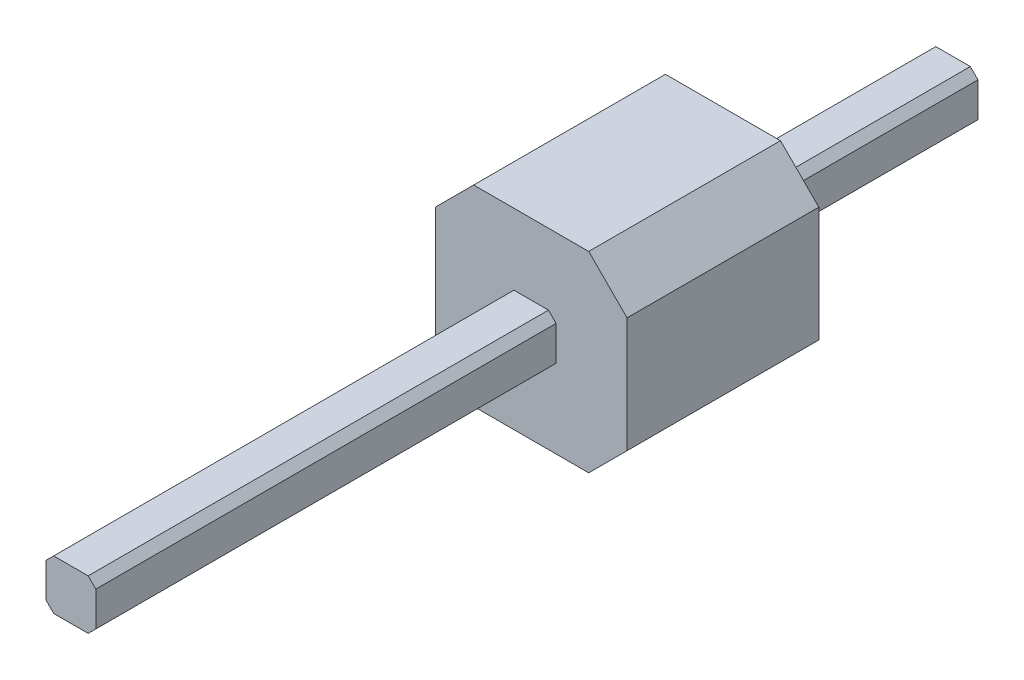
ISO-10303-21;
HEADER;
FILE_DESCRIPTION(('STEP AP214'),'2;1');
FILE_NAME('part.step','',(''),(''),'','','');
FILE_SCHEMA(('AUTOMOTIVE_DESIGN { 1 0 10303 214 1 1 1 1 }'));
ENDSEC;
DATA;
#1=APPLICATION_CONTEXT('core data for automotive mechanical design processes');
#2=APPLICATION_PROTOCOL_DEFINITION('international standard','automotive_design',2000,#1);
#3=PRODUCT_CONTEXT('',#1,'mechanical');
#4=PRODUCT('Part','Part','',(#3));
#5=PRODUCT_RELATED_PRODUCT_CATEGORY('part','',(#4));
#6=PRODUCT_DEFINITION_FORMATION('','',#4);
#7=PRODUCT_DEFINITION_CONTEXT('part definition',#1,'design');
#8=PRODUCT_DEFINITION('design','',#6,#7);
#9=PRODUCT_DEFINITION_SHAPE('','',#8);
#10=(LENGTH_UNIT() NAMED_UNIT(*) SI_UNIT(.MILLI.,.METRE.));
#11=(NAMED_UNIT(*) PLANE_ANGLE_UNIT() SI_UNIT($,.RADIAN.));
#12=(NAMED_UNIT(*) SI_UNIT($,.STERADIAN.) SOLID_ANGLE_UNIT());
#13=UNCERTAINTY_MEASURE_WITH_UNIT(LENGTH_MEASURE(1.E-05),#10,'distance_accuracy_value','');
#14=(GEOMETRIC_REPRESENTATION_CONTEXT(3) GLOBAL_UNCERTAINTY_ASSIGNED_CONTEXT((#13)) GLOBAL_UNIT_ASSIGNED_CONTEXT((#10,
#11,#12)) REPRESENTATION_CONTEXT('',''));
#15=CARTESIAN_POINT('',(0.,0.,0.));
#16=DIRECTION('',(0.,0.,1.));
#17=DIRECTION('',(1.,0.,0.));
#18=AXIS2_PLACEMENT_3D('',#15,#16,#17);
#19=CARTESIAN_POINT('',(-0.225,-0.324999999999999,0.));
#20=DIRECTION('',(0.,-1.,0.));
#21=DIRECTION('',(0.,0.,-1.));
#22=AXIS2_PLACEMENT_3D('',#19,#20,#21);
#23=PLANE('',#22);
#24=DIRECTION('',(0.,0.,1.));
#25=VECTOR('',#24,1.);
#26=CARTESIAN_POINT('',(-0.225,-0.324999999999999,0.));
#27=LINE('',#26,#25);
#28=CARTESIAN_POINT('',(-0.225,-0.324999999999999,-3.));
#29=VERTEX_POINT('',#28);
#30=CARTESIAN_POINT('',(-0.225,-0.324999999999999,8.5));
#31=VERTEX_POINT('',#30);
#32=EDGE_CURVE('P0_E86',#29,#31,#27,.T.);
#33=ORIENTED_EDGE('',*,*,#32,.F.);
#34=DIRECTION('',(1.,0.,0.));
#35=VECTOR('',#34,1.);
#36=CARTESIAN_POINT('',(-0.225,-0.324999999999999,-3.));
#37=LINE('',#36,#35);
#38=CARTESIAN_POINT('',(0.225,-0.324999999999999,-3.));
#39=VERTEX_POINT('',#38);
#40=EDGE_CURVE('P0_E79',#29,#39,#37,.T.);
#41=ORIENTED_EDGE('',*,*,#40,.T.);
#42=DIRECTION('',(0.,0.,1.));
#43=VECTOR('',#42,1.);
#44=CARTESIAN_POINT('',(0.225,-0.324999999999999,0.));
#45=LINE('',#44,#43);
#46=CARTESIAN_POINT('',(0.225,-0.324999999999999,8.5));
#47=VERTEX_POINT('',#46);
#48=EDGE_CURVE('P0_E89',#47,#39,#45,.F.);
#49=ORIENTED_EDGE('',*,*,#48,.F.);
#50=DIRECTION('',(1.,0.,0.));
#51=VECTOR('',#50,1.);
#52=CARTESIAN_POINT('',(-0.225,-0.324999999999999,8.5));
#53=LINE('',#52,#51);
#54=EDGE_CURVE('P0_E20',#47,#31,#53,.F.);
#55=ORIENTED_EDGE('',*,*,#54,.T.);
#56=EDGE_LOOP('',(#33,#41,#49,#55));
#57=FACE_BOUND('',#56,.T.);
#58=ADVANCED_FACE('P0_F17',(#57),#23,.T.);
#59=CARTESIAN_POINT('',(-0.325,-0.224999999999999,0.));
#60=DIRECTION('',(-0.707106781186548,-0.707106781186548,0.));
#61=DIRECTION('',(0.707106781186548,-0.707106781186548,0.));
#62=AXIS2_PLACEMENT_3D('',#59,#60,#61);
#63=PLANE('',#62);
#64=DIRECTION('',(0.,0.,1.));
#65=VECTOR('',#64,1.);
#66=CARTESIAN_POINT('',(-0.325,-0.224999999999999,0.));
#67=LINE('',#66,#65);
#68=CARTESIAN_POINT('',(-0.325,-0.224999999999999,-3.));
#69=VERTEX_POINT('',#68);
#70=CARTESIAN_POINT('',(-0.325,-0.224999999999999,8.5));
#71=VERTEX_POINT('',#70);
#72=EDGE_CURVE('P0_E111',#69,#71,#67,.T.);
#73=ORIENTED_EDGE('',*,*,#72,.F.);
#74=DIRECTION('',(0.707106781186548,-0.707106781186548,0.));
#75=VECTOR('',#74,1.);
#76=CARTESIAN_POINT('',(-0.325,-0.224999999999999,-3.));
#77=LINE('',#76,#75);
#78=EDGE_CURVE('P0_E100',#69,#29,#77,.T.);
#79=ORIENTED_EDGE('',*,*,#78,.T.);
#80=ORIENTED_EDGE('',*,*,#32,.T.);
#81=DIRECTION('',(0.707106781186548,-0.707106781186548,0.));
#82=VECTOR('',#81,1.);
#83=CARTESIAN_POINT('',(-0.325,-0.224999999999999,8.5));
#84=LINE('',#83,#82);
#85=EDGE_CURVE('P0_E93',#31,#71,#84,.F.);
#86=ORIENTED_EDGE('',*,*,#85,.T.);
#87=EDGE_LOOP('',(#73,#79,#80,#86));
#88=FACE_BOUND('',#87,.T.);
#89=ADVANCED_FACE('P0_F102',(#88),#63,.T.);
#90=CARTESIAN_POINT('',(0.225,-0.324999999999999,0.));
#91=DIRECTION('',(0.707106781186549,-0.707106781186547,0.));
#92=DIRECTION('',(0.707106781186547,0.707106781186549,0.));
#93=AXIS2_PLACEMENT_3D('',#90,#91,#92);
#94=PLANE('',#93);
#95=ORIENTED_EDGE('',*,*,#48,.T.);
#96=DIRECTION('',(0.707106781186547,0.707106781186549,0.));
#97=VECTOR('',#96,1.);
#98=CARTESIAN_POINT('',(0.225,-0.324999999999999,-3.));
#99=LINE('',#98,#97);
#100=CARTESIAN_POINT('',(0.325,-0.224999999999999,-3.));
#101=VERTEX_POINT('',#100);
#102=EDGE_CURVE('P0_E109',#39,#101,#99,.T.);
#103=ORIENTED_EDGE('',*,*,#102,.T.);
#104=DIRECTION('',(0.,0.,-1.));
#105=VECTOR('',#104,1.);
#106=CARTESIAN_POINT('',(0.325,-0.224999999999999,0.));
#107=LINE('',#106,#105);
#108=CARTESIAN_POINT('',(0.325,-0.224999999999999,8.5));
#109=VERTEX_POINT('',#108);
#110=EDGE_CURVE('P0_E117',#109,#101,#107,.T.);
#111=ORIENTED_EDGE('',*,*,#110,.F.);
#112=DIRECTION('',(0.707106781186547,0.707106781186549,0.));
#113=VECTOR('',#112,1.);
#114=CARTESIAN_POINT('',(0.225,-0.324999999999999,8.5));
#115=LINE('',#114,#113);
#116=EDGE_CURVE('P0_E106',#109,#47,#115,.F.);
#117=ORIENTED_EDGE('',*,*,#116,.T.);
#118=EDGE_LOOP('',(#95,#103,#111,#117));
#119=FACE_BOUND('',#118,.T.);
#120=ADVANCED_FACE('P0_F163',(#119),#94,.T.);
#121=CARTESIAN_POINT('',(-0.325,0.225,0.));
#122=DIRECTION('',(-1.,0.,0.));
#123=DIRECTION('',(0.,0.,1.));
#124=AXIS2_PLACEMENT_3D('',#121,#122,#123);
#125=PLANE('',#124);
#126=DIRECTION('',(0.,0.,1.));
#127=VECTOR('',#126,1.);
#128=CARTESIAN_POINT('',(-0.325,0.225,0.));
#129=LINE('',#128,#127);
#130=CARTESIAN_POINT('',(-0.325,0.225,-3.));
#131=VERTEX_POINT('',#130);
#132=CARTESIAN_POINT('',(-0.325,0.225,8.5));
#133=VERTEX_POINT('',#132);
#134=EDGE_CURVE('P0_E122',#131,#133,#129,.T.);
#135=ORIENTED_EDGE('',*,*,#134,.F.);
#136=DIRECTION('',(0.,1.,0.));
#137=VECTOR('',#136,1.);
#138=CARTESIAN_POINT('',(-0.325,0.225,-3.));
#139=LINE('',#138,#137);
#140=EDGE_CURVE('P0_E114',#131,#69,#139,.F.);
#141=ORIENTED_EDGE('',*,*,#140,.T.);
#142=ORIENTED_EDGE('',*,*,#72,.T.);
#143=DIRECTION('',(0.,1.,0.));
#144=VECTOR('',#143,1.);
#145=CARTESIAN_POINT('',(-0.325,0.225,8.5));
#146=LINE('',#145,#144);
#147=EDGE_CURVE('P0_E96',#71,#133,#146,.T.);
#148=ORIENTED_EDGE('',*,*,#147,.T.);
#149=EDGE_LOOP('',(#135,#141,#142,#148));
#150=FACE_BOUND('',#149,.T.);
#151=ADVANCED_FACE('P0_F161',(#150),#125,.T.);
#152=CARTESIAN_POINT('',(0.325,-0.224999999999999,0.));
#153=DIRECTION('',(1.,0.,0.));
#154=DIRECTION('',(0.,0.,-1.));
#155=AXIS2_PLACEMENT_3D('',#152,#153,#154);
#156=PLANE('',#155);
#157=ORIENTED_EDGE('',*,*,#110,.T.);
#158=DIRECTION('',(0.,1.,0.));
#159=VECTOR('',#158,1.);
#160=CARTESIAN_POINT('',(0.325,-0.224999999999999,-3.));
#161=LINE('',#160,#159);
#162=CARTESIAN_POINT('',(0.325,0.225,-3.));
#163=VERTEX_POINT('',#162);
#164=EDGE_CURVE('P0_E120',#101,#163,#161,.T.);
#165=ORIENTED_EDGE('',*,*,#164,.T.);
#166=DIRECTION('',(0.,0.,1.));
#167=VECTOR('',#166,1.);
#168=CARTESIAN_POINT('',(0.325,0.225,0.));
#169=LINE('',#168,#167);
#170=CARTESIAN_POINT('',(0.325,0.225,8.5));
#171=VERTEX_POINT('',#170);
#172=EDGE_CURVE('P0_E132',#171,#163,#169,.F.);
#173=ORIENTED_EDGE('',*,*,#172,.F.);
#174=DIRECTION('',(0.,1.,0.));
#175=VECTOR('',#174,1.);
#176=CARTESIAN_POINT('',(0.325,0.,8.5));
#177=LINE('',#176,#175);
#178=EDGE_CURVE('P0_E127',#109,#171,#177,.T.);
#179=ORIENTED_EDGE('',*,*,#178,.F.);
#180=EDGE_LOOP('',(#157,#165,#173,#179));
#181=FACE_BOUND('',#180,.T.);
#182=ADVANCED_FACE('P0_F153',(#181),#156,.T.);
#183=CARTESIAN_POINT('',(-0.225,0.325,0.));
#184=DIRECTION('',(-0.707106781186548,0.707106781186548,0.));
#185=DIRECTION('',(-0.707106781186548,-0.707106781186548,0.));
#186=AXIS2_PLACEMENT_3D('',#183,#184,#185);
#187=PLANE('',#186);
#188=DIRECTION('',(0.,0.,1.));
#189=VECTOR('',#188,1.);
#190=CARTESIAN_POINT('',(-0.225,0.325,0.));
#191=LINE('',#190,#189);
#192=CARTESIAN_POINT('',(-0.225,0.325,-3.));
#193=VERTEX_POINT('',#192);
#194=CARTESIAN_POINT('',(-0.225,0.325,8.5));
#195=VERTEX_POINT('',#194);
#196=EDGE_CURVE('P0_E138',#193,#195,#191,.T.);
#197=ORIENTED_EDGE('',*,*,#196,.F.);
#198=DIRECTION('',(0.707106781186548,0.707106781186548,0.));
#199=VECTOR('',#198,1.);
#200=CARTESIAN_POINT('',(-0.325,0.225,-3.));
#201=LINE('',#200,#199);
#202=EDGE_CURVE('P0_E134',#131,#193,#201,.T.);
#203=ORIENTED_EDGE('',*,*,#202,.F.);
#204=ORIENTED_EDGE('',*,*,#134,.T.);
#205=DIRECTION('',(-0.707106781186548,-0.707106781186548,0.));
#206=VECTOR('',#205,1.);
#207=CARTESIAN_POINT('',(-0.225,0.325,8.5));
#208=LINE('',#207,#206);
#209=EDGE_CURVE('P0_E125',#195,#133,#208,.T.);
#210=ORIENTED_EDGE('',*,*,#209,.F.);
#211=EDGE_LOOP('',(#197,#203,#204,#210));
#212=FACE_BOUND('',#211,.T.);
#213=ADVANCED_FACE('P0_F159',(#212),#187,.T.);
#214=CARTESIAN_POINT('',(0.,0.,8.5));
#215=DIRECTION('',(0.,0.,1.));
#216=DIRECTION('',(1.,0.,0.));
#217=AXIS2_PLACEMENT_3D('',#214,#215,#216);
#218=PLANE('',#217);
#219=DIRECTION('',(-0.707106781186548,0.707106781186548,0.));
#220=VECTOR('',#219,1.);
#221=CARTESIAN_POINT('',(0.325,0.225,8.5));
#222=LINE('',#221,#220);
#223=CARTESIAN_POINT('',(0.225,0.325,8.5));
#224=VERTEX_POINT('',#223);
#225=EDGE_CURVE('P0_E129',#224,#171,#222,.F.);
#226=ORIENTED_EDGE('',*,*,#225,.F.);
#227=DIRECTION('',(1.,0.,0.));
#228=VECTOR('',#227,1.);
#229=CARTESIAN_POINT('',(0.225,0.325,8.5));
#230=LINE('',#229,#228);
#231=EDGE_CURVE('P0_E141',#195,#224,#230,.T.);
#232=ORIENTED_EDGE('',*,*,#231,.F.);
#233=ORIENTED_EDGE('',*,*,#209,.T.);
#234=ORIENTED_EDGE('',*,*,#147,.F.);
#235=ORIENTED_EDGE('',*,*,#85,.F.);
#236=ORIENTED_EDGE('',*,*,#54,.F.);
#237=ORIENTED_EDGE('',*,*,#116,.F.);
#238=ORIENTED_EDGE('',*,*,#178,.T.);
#239=EDGE_LOOP('',(#226,#232,#233,#234,#235,#236,#237,#238));
#240=FACE_BOUND('',#239,.T.);
#241=ADVANCED_FACE('P0_F94',(#240),#218,.T.);
#242=CARTESIAN_POINT('',(0.325,0.225,0.));
#243=DIRECTION('',(0.707106781186548,0.707106781186548,0.));
#244=DIRECTION('',(-0.707106781186548,0.707106781186548,0.));
#245=AXIS2_PLACEMENT_3D('',#242,#243,#244);
#246=PLANE('',#245);
#247=ORIENTED_EDGE('',*,*,#172,.T.);
#248=DIRECTION('',(0.707106781186548,-0.707106781186548,0.));
#249=VECTOR('',#248,1.);
#250=CARTESIAN_POINT('',(0.225,0.325,-3.));
#251=LINE('',#250,#249);
#252=CARTESIAN_POINT('',(0.225,0.325,-3.));
#253=VERTEX_POINT('',#252);
#254=EDGE_CURVE('P0_E35',#253,#163,#251,.T.);
#255=ORIENTED_EDGE('',*,*,#254,.F.);
#256=DIRECTION('',(0.,0.,1.));
#257=VECTOR('',#256,1.);
#258=CARTESIAN_POINT('',(0.225,0.325,0.));
#259=LINE('',#258,#257);
#260=EDGE_CURVE('P0_E26',#224,#253,#259,.F.);
#261=ORIENTED_EDGE('',*,*,#260,.F.);
#262=ORIENTED_EDGE('',*,*,#225,.T.);
#263=EDGE_LOOP('',(#247,#255,#261,#262));
#264=FACE_BOUND('',#263,.T.);
#265=ADVANCED_FACE('P0_F148',(#264),#246,.T.);
#266=CARTESIAN_POINT('',(0.,0.,-3.));
#267=DIRECTION('',(0.,0.,-1.));
#268=DIRECTION('',(-1.,0.,0.));
#269=AXIS2_PLACEMENT_3D('',#266,#267,#268);
#270=PLANE('',#269);
#271=ORIENTED_EDGE('',*,*,#78,.F.);
#272=ORIENTED_EDGE('',*,*,#140,.F.);
#273=ORIENTED_EDGE('',*,*,#202,.T.);
#274=DIRECTION('',(1.,0.,0.));
#275=VECTOR('',#274,1.);
#276=CARTESIAN_POINT('',(0.225,0.325,-3.));
#277=LINE('',#276,#275);
#278=EDGE_CURVE('P0_E11',#253,#193,#277,.F.);
#279=ORIENTED_EDGE('',*,*,#278,.F.);
#280=ORIENTED_EDGE('',*,*,#254,.T.);
#281=ORIENTED_EDGE('',*,*,#164,.F.);
#282=ORIENTED_EDGE('',*,*,#102,.F.);
#283=ORIENTED_EDGE('',*,*,#40,.F.);
#284=EDGE_LOOP('',(#271,#272,#273,#279,#280,#281,#282,#283));
#285=FACE_BOUND('',#284,.T.);
#286=ADVANCED_FACE('P0_F155',(#285),#270,.T.);
#287=CARTESIAN_POINT('',(0.225,0.325,0.));
#288=DIRECTION('',(0.,1.,0.));
#289=DIRECTION('',(0.,0.,1.));
#290=AXIS2_PLACEMENT_3D('',#287,#288,#289);
#291=PLANE('',#290);
#292=ORIENTED_EDGE('',*,*,#260,.T.);
#293=ORIENTED_EDGE('',*,*,#278,.T.);
#294=ORIENTED_EDGE('',*,*,#196,.T.);
#295=ORIENTED_EDGE('',*,*,#231,.T.);
#296=EDGE_LOOP('',(#292,#293,#294,#295));
#297=FACE_BOUND('',#296,.T.);
#298=ADVANCED_FACE('P0_F146',(#297),#291,.T.);
#299=CLOSED_SHELL('',(#58,#89,#120,#151,#182,#213,#241,#265,#286,#298));
#300=MANIFOLD_SOLID_BREP('P0_B1',#299);
#301=CARTESIAN_POINT('',(1.25,-0.75,0.));
#302=DIRECTION('',(1.,0.,0.));
#303=DIRECTION('',(0.,0.,-1.));
#304=AXIS2_PLACEMENT_3D('',#301,#302,#303);
#305=PLANE('',#304);
#306=DIRECTION('',(0.,1.,0.));
#307=VECTOR('',#306,1.);
#308=CARTESIAN_POINT('',(1.25,-0.75,2.5));
#309=LINE('',#308,#307);
#310=CARTESIAN_POINT('',(1.25,0.750000000000002,2.5));
#311=VERTEX_POINT('',#310);
#312=CARTESIAN_POINT('',(1.25,-0.75,2.5));
#313=VERTEX_POINT('',#312);
#314=EDGE_CURVE('P1_E125',#311,#313,#309,.F.);
#315=ORIENTED_EDGE('',*,*,#314,.T.);
#316=DIRECTION('',(0.,0.,1.));
#317=VECTOR('',#316,1.);
#318=CARTESIAN_POINT('',(1.25,-0.75,0.));
#319=LINE('',#318,#317);
#320=CARTESIAN_POINT('',(1.25,-0.75,0.));
#321=VERTEX_POINT('',#320);
#322=EDGE_CURVE('P1_E138',#321,#313,#319,.T.);
#323=ORIENTED_EDGE('',*,*,#322,.F.);
#324=DIRECTION('',(0.,1.,0.));
#325=VECTOR('',#324,1.);
#326=CARTESIAN_POINT('',(1.25,-0.75,0.));
#327=LINE('',#326,#325);
#328=CARTESIAN_POINT('',(1.25,0.750000000000002,0.));
#329=VERTEX_POINT('',#328);
#330=EDGE_CURVE('P1_E19',#321,#329,#327,.T.);
#331=ORIENTED_EDGE('',*,*,#330,.T.);
#332=DIRECTION('',(0.,0.,1.));
#333=VECTOR('',#332,1.);
#334=CARTESIAN_POINT('',(1.25,0.750000000000002,0.));
#335=LINE('',#334,#333);
#336=EDGE_CURVE('P1_E182',#311,#329,#335,.F.);
#337=ORIENTED_EDGE('',*,*,#336,.F.);
#338=EDGE_LOOP('',(#315,#323,#331,#337));
#339=FACE_BOUND('',#338,.T.);
#340=ADVANCED_FACE('P1_F16',(#339),#305,.T.);
#341=CARTESIAN_POINT('',(0.325,0.225,0.));
#342=DIRECTION('',(-1.,0.,0.));
#343=DIRECTION('',(0.,0.,1.));
#344=AXIS2_PLACEMENT_3D('',#341,#342,#343);
#345=PLANE('',#344);
#346=DIRECTION('',(0.,1.,0.));
#347=VECTOR('',#346,1.);
#348=CARTESIAN_POINT('',(0.325,0.225,2.5));
#349=LINE('',#348,#347);
#350=CARTESIAN_POINT('',(0.325,-0.224999999999999,2.5));
#351=VERTEX_POINT('',#350);
#352=CARTESIAN_POINT('',(0.325,0.225,2.5));
#353=VERTEX_POINT('',#352);
#354=EDGE_CURVE('P1_E146',#351,#353,#349,.T.);
#355=ORIENTED_EDGE('',*,*,#354,.T.);
#356=DIRECTION('',(0.,0.,1.));
#357=VECTOR('',#356,1.);
#358=CARTESIAN_POINT('',(0.325,0.225,0.));
#359=LINE('',#358,#357);
#360=CARTESIAN_POINT('',(0.325,0.225,0.));
#361=VERTEX_POINT('',#360);
#362=EDGE_CURVE('P1_E161',#361,#353,#359,.T.);
#363=ORIENTED_EDGE('',*,*,#362,.F.);
#364=DIRECTION('',(0.,1.,0.));
#365=VECTOR('',#364,1.);
#366=CARTESIAN_POINT('',(0.325,0.225,0.));
#367=LINE('',#366,#365);
#368=CARTESIAN_POINT('',(0.325,-0.224999999999999,0.));
#369=VERTEX_POINT('',#368);
#370=EDGE_CURVE('P1_E148',#361,#369,#367,.F.);
#371=ORIENTED_EDGE('',*,*,#370,.T.);
#372=DIRECTION('',(0.,0.,1.));
#373=VECTOR('',#372,1.);
#374=CARTESIAN_POINT('',(0.325,-0.224999999999999,0.));
#375=LINE('',#374,#373);
#376=EDGE_CURVE('P1_E158',#351,#369,#375,.F.);
#377=ORIENTED_EDGE('',*,*,#376,.F.);
#378=EDGE_LOOP('',(#355,#363,#371,#377));
#379=FACE_BOUND('',#378,.T.);
#380=ADVANCED_FACE('P1_F157',(#379),#345,.T.);
#381=CARTESIAN_POINT('',(0.75,-1.25,0.));
#382=DIRECTION('',(0.707106781186548,-0.707106781186548,0.));
#383=DIRECTION('',(0.707106781186548,0.707106781186548,0.));
#384=AXIS2_PLACEMENT_3D('',#381,#382,#383);
#385=PLANE('',#384);
#386=DIRECTION('',(0.707106781186548,0.707106781186548,0.));
#387=VECTOR('',#386,1.);
#388=CARTESIAN_POINT('',(0.75,-1.25,2.5));
#389=LINE('',#388,#387);
#390=CARTESIAN_POINT('',(0.75,-1.25,2.5));
#391=VERTEX_POINT('',#390);
#392=EDGE_CURVE('P1_E140',#313,#391,#389,.F.);
#393=ORIENTED_EDGE('',*,*,#392,.T.);
#394=DIRECTION('',(0.,0.,-1.));
#395=VECTOR('',#394,1.);
#396=CARTESIAN_POINT('',(0.75,-1.25,0.));
#397=LINE('',#396,#395);
#398=CARTESIAN_POINT('',(0.75,-1.25,0.));
#399=VERTEX_POINT('',#398);
#400=EDGE_CURVE('P1_E144',#399,#391,#397,.F.);
#401=ORIENTED_EDGE('',*,*,#400,.F.);
#402=DIRECTION('',(0.707106781186548,0.707106781186548,0.));
#403=VECTOR('',#402,1.);
#404=CARTESIAN_POINT('',(0.75,-1.25,0.));
#405=LINE('',#404,#403);
#406=EDGE_CURVE('P1_E132',#399,#321,#405,.T.);
#407=ORIENTED_EDGE('',*,*,#406,.T.);
#408=ORIENTED_EDGE('',*,*,#322,.T.);
#409=EDGE_LOOP('',(#393,#401,#407,#408));
#410=FACE_BOUND('',#409,.T.);
#411=ADVANCED_FACE('P1_F142',(#410),#385,.T.);
#412=CARTESIAN_POINT('',(1.25,0.750000000000002,0.));
#413=DIRECTION('',(0.707106781186546,0.707106781186549,0.));
#414=DIRECTION('',(-0.707106781186549,0.707106781186546,0.));
#415=AXIS2_PLACEMENT_3D('',#412,#413,#414);
#416=PLANE('',#415);
#417=DIRECTION('',(-0.707106781186549,0.707106781186546,0.));
#418=VECTOR('',#417,1.);
#419=CARTESIAN_POINT('',(1.25,0.750000000000002,2.5));
#420=LINE('',#419,#418);
#421=CARTESIAN_POINT('',(0.75,1.25,2.5));
#422=VERTEX_POINT('',#421);
#423=EDGE_CURVE('P1_E184',#422,#311,#420,.F.);
#424=ORIENTED_EDGE('',*,*,#423,.T.);
#425=ORIENTED_EDGE('',*,*,#336,.T.);
#426=DIRECTION('',(-0.707106781186549,0.707106781186546,0.));
#427=VECTOR('',#426,1.);
#428=CARTESIAN_POINT('',(1.25,0.750000000000002,0.));
#429=LINE('',#428,#427);
#430=CARTESIAN_POINT('',(0.75,1.25,0.));
#431=VERTEX_POINT('',#430);
#432=EDGE_CURVE('P1_E135',#329,#431,#429,.T.);
#433=ORIENTED_EDGE('',*,*,#432,.T.);
#434=DIRECTION('',(0.,0.,1.));
#435=VECTOR('',#434,1.);
#436=CARTESIAN_POINT('',(0.75,1.25,0.));
#437=LINE('',#436,#435);
#438=EDGE_CURVE('P1_E205',#422,#431,#437,.F.);
#439=ORIENTED_EDGE('',*,*,#438,.F.);
#440=EDGE_LOOP('',(#424,#425,#433,#439));
#441=FACE_BOUND('',#440,.T.);
#442=ADVANCED_FACE('P1_F286',(#441),#416,.T.);
#443=CARTESIAN_POINT('',(0.225,0.325,0.));
#444=DIRECTION('',(-0.707106781186548,-0.707106781186548,0.));
#445=DIRECTION('',(0.707106781186548,-0.707106781186548,0.));
#446=AXIS2_PLACEMENT_3D('',#443,#444,#445);
#447=PLANE('',#446);
#448=DIRECTION('',(0.707106781186548,-0.707106781186548,0.));
#449=VECTOR('',#448,1.);
#450=CARTESIAN_POINT('',(0.225,0.325,2.5));
#451=LINE('',#450,#449);
#452=CARTESIAN_POINT('',(0.225,0.325,2.5));
#453=VERTEX_POINT('',#452);
#454=EDGE_CURVE('P1_E177',#353,#453,#451,.F.);
#455=ORIENTED_EDGE('',*,*,#454,.T.);
#456=DIRECTION('',(0.,0.,-1.));
#457=VECTOR('',#456,1.);
#458=CARTESIAN_POINT('',(0.225,0.325,0.));
#459=LINE('',#458,#457);
#460=CARTESIAN_POINT('',(0.225,0.325,0.));
#461=VERTEX_POINT('',#460);
#462=EDGE_CURVE('P1_E208',#461,#453,#459,.F.);
#463=ORIENTED_EDGE('',*,*,#462,.F.);
#464=DIRECTION('',(0.707106781186548,-0.707106781186548,0.));
#465=VECTOR('',#464,1.);
#466=CARTESIAN_POINT('',(0.225,0.325,0.));
#467=LINE('',#466,#465);
#468=EDGE_CURVE('P1_E180',#461,#361,#467,.T.);
#469=ORIENTED_EDGE('',*,*,#468,.T.);
#470=ORIENTED_EDGE('',*,*,#362,.T.);
#471=EDGE_LOOP('',(#455,#463,#469,#470));
#472=FACE_BOUND('',#471,.T.);
#473=ADVANCED_FACE('P1_F288',(#472),#447,.T.);
#474=CARTESIAN_POINT('',(0.325,-0.224999999999999,0.));
#475=DIRECTION('',(-0.707106781186549,0.707106781186547,0.));
#476=DIRECTION('',(-0.707106781186547,-0.707106781186549,0.));
#477=AXIS2_PLACEMENT_3D('',#474,#475,#476);
#478=PLANE('',#477);
#479=DIRECTION('',(-0.707106781186547,-0.707106781186549,0.));
#480=VECTOR('',#479,1.);
#481=CARTESIAN_POINT('',(0.325,-0.224999999999999,2.5));
#482=LINE('',#481,#480);
#483=CARTESIAN_POINT('',(0.225,-0.324999999999999,2.5));
#484=VERTEX_POINT('',#483);
#485=EDGE_CURVE('P1_E169',#484,#351,#482,.F.);
#486=ORIENTED_EDGE('',*,*,#485,.T.);
#487=ORIENTED_EDGE('',*,*,#376,.T.);
#488=DIRECTION('',(-0.707106781186547,-0.707106781186549,0.));
#489=VECTOR('',#488,1.);
#490=CARTESIAN_POINT('',(0.325,-0.224999999999999,0.));
#491=LINE('',#490,#489);
#492=CARTESIAN_POINT('',(0.225,-0.324999999999999,0.));
#493=VERTEX_POINT('',#492);
#494=EDGE_CURVE('P1_E167',#369,#493,#491,.T.);
#495=ORIENTED_EDGE('',*,*,#494,.T.);
#496=DIRECTION('',(0.,0.,1.));
#497=VECTOR('',#496,1.);
#498=CARTESIAN_POINT('',(0.225,-0.324999999999999,0.));
#499=LINE('',#498,#497);
#500=EDGE_CURVE('P1_E216',#484,#493,#499,.F.);
#501=ORIENTED_EDGE('',*,*,#500,.F.);
#502=EDGE_LOOP('',(#486,#487,#495,#501));
#503=FACE_BOUND('',#502,.T.);
#504=ADVANCED_FACE('P1_F165',(#503),#478,.T.);
#505=CARTESIAN_POINT('',(-0.75,-1.25,0.));
#506=DIRECTION('',(0.,-1.,0.));
#507=DIRECTION('',(0.,0.,-1.));
#508=AXIS2_PLACEMENT_3D('',#505,#506,#507);
#509=PLANE('',#508);
#510=DIRECTION('',(1.,0.,0.));
#511=VECTOR('',#510,1.);
#512=CARTESIAN_POINT('',(-0.75,-1.25,2.5));
#513=LINE('',#512,#511);
#514=CARTESIAN_POINT('',(-0.75,-1.25,2.5));
#515=VERTEX_POINT('',#514);
#516=EDGE_CURVE('P1_E190',#391,#515,#513,.F.);
#517=ORIENTED_EDGE('',*,*,#516,.T.);
#518=DIRECTION('',(0.,0.,1.));
#519=VECTOR('',#518,1.);
#520=CARTESIAN_POINT('',(-0.75,-1.25,0.));
#521=LINE('',#520,#519);
#522=CARTESIAN_POINT('',(-0.75,-1.25,0.));
#523=VERTEX_POINT('',#522);
#524=EDGE_CURVE('P1_E218',#523,#515,#521,.T.);
#525=ORIENTED_EDGE('',*,*,#524,.F.);
#526=DIRECTION('',(1.,0.,0.));
#527=VECTOR('',#526,1.);
#528=CARTESIAN_POINT('',(-0.75,-1.25,0.));
#529=LINE('',#528,#527);
#530=EDGE_CURVE('P1_E170',#523,#399,#529,.T.);
#531=ORIENTED_EDGE('',*,*,#530,.T.);
#532=ORIENTED_EDGE('',*,*,#400,.T.);
#533=EDGE_LOOP('',(#517,#525,#531,#532));
#534=FACE_BOUND('',#533,.T.);
#535=ADVANCED_FACE('P1_F199',(#534),#509,.T.);
#536=CARTESIAN_POINT('',(0.75,1.25,0.));
#537=DIRECTION('',(0.,1.,0.));
#538=DIRECTION('',(0.,0.,1.));
#539=AXIS2_PLACEMENT_3D('',#536,#537,#538);
#540=PLANE('',#539);
#541=DIRECTION('',(1.,0.,0.));
#542=VECTOR('',#541,1.);
#543=CARTESIAN_POINT('',(0.75,1.25,2.5));
#544=LINE('',#543,#542);
#545=CARTESIAN_POINT('',(-0.75,1.25,2.5));
#546=VERTEX_POINT('',#545);
#547=EDGE_CURVE('P1_E202',#546,#422,#544,.T.);
#548=ORIENTED_EDGE('',*,*,#547,.T.);
#549=ORIENTED_EDGE('',*,*,#438,.T.);
#550=DIRECTION('',(1.,0.,0.));
#551=VECTOR('',#550,1.);
#552=CARTESIAN_POINT('',(0.75,1.25,0.));
#553=LINE('',#552,#551);
#554=CARTESIAN_POINT('',(-0.75,1.25,0.));
#555=VERTEX_POINT('',#554);
#556=EDGE_CURVE('P1_E197',#431,#555,#553,.F.);
#557=ORIENTED_EDGE('',*,*,#556,.T.);
#558=DIRECTION('',(0.,0.,1.));
#559=VECTOR('',#558,1.);
#560=CARTESIAN_POINT('',(-0.75,1.25,0.));
#561=LINE('',#560,#559);
#562=EDGE_CURVE('P1_E224',#546,#555,#561,.F.);
#563=ORIENTED_EDGE('',*,*,#562,.F.);
#564=EDGE_LOOP('',(#548,#549,#557,#563));
#565=FACE_BOUND('',#564,.T.);
#566=ADVANCED_FACE('P1_F283',(#565),#540,.T.);
#567=CARTESIAN_POINT('',(-0.225,0.325,0.));
#568=DIRECTION('',(0.,-1.,0.));
#569=DIRECTION('',(0.,0.,-1.));
#570=AXIS2_PLACEMENT_3D('',#567,#568,#569);
#571=PLANE('',#570);
#572=DIRECTION('',(1.,0.,0.));
#573=VECTOR('',#572,1.);
#574=CARTESIAN_POINT('',(-0.225,0.325,2.5));
#575=LINE('',#574,#573);
#576=CARTESIAN_POINT('',(-0.225,0.325,2.5));
#577=VERTEX_POINT('',#576);
#578=EDGE_CURVE('P1_E211',#453,#577,#575,.F.);
#579=ORIENTED_EDGE('',*,*,#578,.T.);
#580=DIRECTION('',(0.,0.,1.));
#581=VECTOR('',#580,1.);
#582=CARTESIAN_POINT('',(-0.225,0.325,0.));
#583=LINE('',#582,#581);
#584=CARTESIAN_POINT('',(-0.225,0.325,0.));
#585=VERTEX_POINT('',#584);
#586=EDGE_CURVE('P1_E240',#585,#577,#583,.T.);
#587=ORIENTED_EDGE('',*,*,#586,.F.);
#588=DIRECTION('',(1.,0.,0.));
#589=VECTOR('',#588,1.);
#590=CARTESIAN_POINT('',(0.,0.325,0.));
#591=LINE('',#590,#589);
#592=EDGE_CURVE('P1_E232',#585,#461,#591,.T.);
#593=ORIENTED_EDGE('',*,*,#592,.T.);
#594=ORIENTED_EDGE('',*,*,#462,.T.);
#595=EDGE_LOOP('',(#579,#587,#593,#594));
#596=FACE_BOUND('',#595,.T.);
#597=ADVANCED_FACE('P1_F326',(#596),#571,.T.);
#598=CARTESIAN_POINT('',(0.225,-0.324999999999999,0.));
#599=DIRECTION('',(0.,1.,0.));
#600=DIRECTION('',(0.,0.,1.));
#601=AXIS2_PLACEMENT_3D('',#598,#599,#600);
#602=PLANE('',#601);
#603=DIRECTION('',(1.,0.,0.));
#604=VECTOR('',#603,1.);
#605=CARTESIAN_POINT('',(0.225,-0.324999999999999,2.5));
#606=LINE('',#605,#604);
#607=CARTESIAN_POINT('',(-0.225,-0.324999999999999,2.5));
#608=VERTEX_POINT('',#607);
#609=EDGE_CURVE('P1_E213',#608,#484,#606,.T.);
#610=ORIENTED_EDGE('',*,*,#609,.T.);
#611=ORIENTED_EDGE('',*,*,#500,.T.);
#612=DIRECTION('',(1.,0.,0.));
#613=VECTOR('',#612,1.);
#614=CARTESIAN_POINT('',(0.,-0.324999999999999,0.));
#615=LINE('',#614,#613);
#616=CARTESIAN_POINT('',(-0.225,-0.324999999999999,0.));
#617=VERTEX_POINT('',#616);
#618=EDGE_CURVE('P1_E235',#493,#617,#615,.F.);
#619=ORIENTED_EDGE('',*,*,#618,.T.);
#620=DIRECTION('',(0.,0.,1.));
#621=VECTOR('',#620,1.);
#622=CARTESIAN_POINT('',(-0.225,-0.324999999999999,0.));
#623=LINE('',#622,#621);
#624=EDGE_CURVE('P1_E249',#608,#617,#623,.F.);
#625=ORIENTED_EDGE('',*,*,#624,.F.);
#626=EDGE_LOOP('',(#610,#611,#619,#625));
#627=FACE_BOUND('',#626,.T.);
#628=ADVANCED_FACE('P1_F323',(#627),#602,.T.);
#629=CARTESIAN_POINT('',(-1.25,-0.75,0.));
#630=DIRECTION('',(-0.707106781186547,-0.707106781186548,0.));
#631=DIRECTION('',(0.707106781186548,-0.707106781186547,0.));
#632=AXIS2_PLACEMENT_3D('',#629,#630,#631);
#633=PLANE('',#632);
#634=DIRECTION('',(0.707106781186548,-0.707106781186547,0.));
#635=VECTOR('',#634,1.);
#636=CARTESIAN_POINT('',(-1.25,-0.75,2.5));
#637=LINE('',#636,#635);
#638=CARTESIAN_POINT('',(-1.25,-0.75,2.5));
#639=VERTEX_POINT('',#638);
#640=EDGE_CURVE('P1_E193',#515,#639,#637,.F.);
#641=ORIENTED_EDGE('',*,*,#640,.T.);
#642=DIRECTION('',(0.,0.,1.));
#643=VECTOR('',#642,1.);
#644=CARTESIAN_POINT('',(-1.25,-0.75,0.));
#645=LINE('',#644,#643);
#646=CARTESIAN_POINT('',(-1.25,-0.75,0.));
#647=VERTEX_POINT('',#646);
#648=EDGE_CURVE('P1_E255',#647,#639,#645,.T.);
#649=ORIENTED_EDGE('',*,*,#648,.F.);
#650=DIRECTION('',(0.707106781186548,-0.707106781186548,0.));
#651=VECTOR('',#650,1.);
#652=CARTESIAN_POINT('',(-1.25,-0.75,0.));
#653=LINE('',#652,#651);
#654=EDGE_CURVE('P1_E229',#647,#523,#653,.T.);
#655=ORIENTED_EDGE('',*,*,#654,.T.);
#656=ORIENTED_EDGE('',*,*,#524,.T.);
#657=EDGE_LOOP('',(#641,#649,#655,#656));
#658=FACE_BOUND('',#657,.T.);
#659=ADVANCED_FACE('P1_F277',(#658),#633,.T.);
#660=CARTESIAN_POINT('',(-0.75,1.25,0.));
#661=DIRECTION('',(-0.707106781186547,0.707106781186548,0.));
#662=DIRECTION('',(-0.707106781186548,-0.707106781186547,0.));
#663=AXIS2_PLACEMENT_3D('',#660,#661,#662);
#664=PLANE('',#663);
#665=DIRECTION('',(-0.707106781186548,-0.707106781186547,0.));
#666=VECTOR('',#665,1.);
#667=CARTESIAN_POINT('',(-0.75,1.25,2.5));
#668=LINE('',#667,#666);
#669=CARTESIAN_POINT('',(-1.25,0.75,2.5));
#670=VERTEX_POINT('',#669);
#671=EDGE_CURVE('P1_E221',#670,#546,#668,.F.);
#672=ORIENTED_EDGE('',*,*,#671,.T.);
#673=ORIENTED_EDGE('',*,*,#562,.T.);
#674=DIRECTION('',(-0.707106781186548,-0.707106781186548,0.));
#675=VECTOR('',#674,1.);
#676=CARTESIAN_POINT('',(-0.75,1.25,0.));
#677=LINE('',#676,#675);
#678=CARTESIAN_POINT('',(-1.25,0.75,0.));
#679=VERTEX_POINT('',#678);
#680=EDGE_CURVE('P1_E227',#555,#679,#677,.T.);
#681=ORIENTED_EDGE('',*,*,#680,.T.);
#682=DIRECTION('',(0.,0.,1.));
#683=VECTOR('',#682,1.);
#684=CARTESIAN_POINT('',(-1.25,0.75,0.));
#685=LINE('',#684,#683);
#686=EDGE_CURVE('P1_E258',#670,#679,#685,.F.);
#687=ORIENTED_EDGE('',*,*,#686,.F.);
#688=EDGE_LOOP('',(#672,#673,#681,#687));
#689=FACE_BOUND('',#688,.T.);
#690=ADVANCED_FACE('P1_F280',(#689),#664,.T.);
#691=CARTESIAN_POINT('',(0.,0.,0.));
#692=DIRECTION('',(0.,0.,1.));
#693=DIRECTION('',(1.,0.,0.));
#694=AXIS2_PLACEMENT_3D('',#691,#692,#693);
#695=PLANE('',#694);
#696=DIRECTION('',(0.,1.,0.));
#697=VECTOR('',#696,1.);
#698=CARTESIAN_POINT('',(-0.325,-0.224999999999999,0.));
#699=LINE('',#698,#697);
#700=CARTESIAN_POINT('',(-0.325,-0.224999999999999,0.));
#701=VERTEX_POINT('',#700);
#702=CARTESIAN_POINT('',(-0.325,0.225,0.));
#703=VERTEX_POINT('',#702);
#704=EDGE_CURVE('P1_E261',#701,#703,#699,.T.);
#705=ORIENTED_EDGE('',*,*,#704,.F.);
#706=DIRECTION('',(-0.707106781186548,0.707106781186548,0.));
#707=VECTOR('',#706,1.);
#708=CARTESIAN_POINT('',(-0.225,-0.324999999999999,0.));
#709=LINE('',#708,#707);
#710=EDGE_CURVE('P1_E245',#617,#701,#709,.T.);
#711=ORIENTED_EDGE('',*,*,#710,.F.);
#712=ORIENTED_EDGE('',*,*,#618,.F.);
#713=ORIENTED_EDGE('',*,*,#494,.F.);
#714=ORIENTED_EDGE('',*,*,#370,.F.);
#715=ORIENTED_EDGE('',*,*,#468,.F.);
#716=ORIENTED_EDGE('',*,*,#592,.F.);
#717=DIRECTION('',(0.707106781186548,0.707106781186548,0.));
#718=VECTOR('',#717,1.);
#719=CARTESIAN_POINT('',(-0.325,0.225,0.));
#720=LINE('',#719,#718);
#721=EDGE_CURVE('P1_E237',#703,#585,#720,.T.);
#722=ORIENTED_EDGE('',*,*,#721,.F.);
#723=EDGE_LOOP('',(#705,#711,#712,#713,#714,#715,#716,#722));
#724=FACE_BOUND('',#723,.T.);
#725=ORIENTED_EDGE('',*,*,#654,.F.);
#726=DIRECTION('',(0.,1.,0.));
#727=VECTOR('',#726,1.);
#728=CARTESIAN_POINT('',(-1.25,0.75,0.));
#729=LINE('',#728,#727);
#730=EDGE_CURVE('P1_E252',#679,#647,#729,.F.);
#731=ORIENTED_EDGE('',*,*,#730,.F.);
#732=ORIENTED_EDGE('',*,*,#680,.F.);
#733=ORIENTED_EDGE('',*,*,#556,.F.);
#734=ORIENTED_EDGE('',*,*,#432,.F.);
#735=ORIENTED_EDGE('',*,*,#330,.F.);
#736=ORIENTED_EDGE('',*,*,#406,.F.);
#737=ORIENTED_EDGE('',*,*,#530,.F.);
#738=EDGE_LOOP('',(#725,#731,#732,#733,#734,#735,#736,#737));
#739=FACE_BOUND('',#738,.T.);
#740=ADVANCED_FACE('P1_F130',(#724,#739),#695,.F.);
#741=CARTESIAN_POINT('',(-0.325,0.225,0.));
#742=DIRECTION('',(0.707106781186548,-0.707106781186548,0.));
#743=DIRECTION('',(0.707106781186548,0.707106781186548,0.));
#744=AXIS2_PLACEMENT_3D('',#741,#742,#743);
#745=PLANE('',#744);
#746=DIRECTION('',(0.707106781186548,0.707106781186548,0.));
#747=VECTOR('',#746,1.);
#748=CARTESIAN_POINT('',(-0.325,0.225,2.5));
#749=LINE('',#748,#747);
#750=CARTESIAN_POINT('',(-0.325,0.225,2.5));
#751=VERTEX_POINT('',#750);
#752=EDGE_CURVE('P1_E243',#577,#751,#749,.F.);
#753=ORIENTED_EDGE('',*,*,#752,.T.);
#754=DIRECTION('',(0.,0.,-1.));
#755=VECTOR('',#754,1.);
#756=CARTESIAN_POINT('',(-0.325,0.225,0.));
#757=LINE('',#756,#755);
#758=EDGE_CURVE('P1_E264',#703,#751,#757,.F.);
#759=ORIENTED_EDGE('',*,*,#758,.F.);
#760=ORIENTED_EDGE('',*,*,#721,.T.);
#761=ORIENTED_EDGE('',*,*,#586,.T.);
#762=EDGE_LOOP('',(#753,#759,#760,#761));
#763=FACE_BOUND('',#762,.T.);
#764=ADVANCED_FACE('P1_F312',(#763),#745,.T.);
#765=CARTESIAN_POINT('',(-0.225,-0.324999999999999,0.));
#766=DIRECTION('',(0.707106781186548,0.707106781186548,0.));
#767=DIRECTION('',(-0.707106781186548,0.707106781186548,0.));
#768=AXIS2_PLACEMENT_3D('',#765,#766,#767);
#769=PLANE('',#768);
#770=DIRECTION('',(-0.707106781186548,0.707106781186548,0.));
#771=VECTOR('',#770,1.);
#772=CARTESIAN_POINT('',(-0.225,-0.324999999999999,2.5));
#773=LINE('',#772,#771);
#774=CARTESIAN_POINT('',(-0.325,-0.224999999999999,2.5));
#775=VERTEX_POINT('',#774);
#776=EDGE_CURVE('P1_E33',#775,#608,#773,.F.);
#777=ORIENTED_EDGE('',*,*,#776,.T.);
#778=ORIENTED_EDGE('',*,*,#624,.T.);
#779=ORIENTED_EDGE('',*,*,#710,.T.);
#780=DIRECTION('',(0.,0.,-1.));
#781=VECTOR('',#780,1.);
#782=CARTESIAN_POINT('',(-0.325,-0.224999999999999,0.));
#783=LINE('',#782,#781);
#784=EDGE_CURVE('P1_E267',#775,#701,#783,.T.);
#785=ORIENTED_EDGE('',*,*,#784,.F.);
#786=EDGE_LOOP('',(#777,#778,#779,#785));
#787=FACE_BOUND('',#786,.T.);
#788=ADVANCED_FACE('P1_F309',(#787),#769,.T.);
#789=CARTESIAN_POINT('',(-1.25,0.75,0.));
#790=DIRECTION('',(-1.,0.,0.));
#791=DIRECTION('',(0.,0.,1.));
#792=AXIS2_PLACEMENT_3D('',#789,#790,#791);
#793=PLANE('',#792);
#794=DIRECTION('',(0.,1.,0.));
#795=VECTOR('',#794,1.);
#796=CARTESIAN_POINT('',(-1.25,0.,2.5));
#797=LINE('',#796,#795);
#798=EDGE_CURVE('P1_E25',#670,#639,#797,.F.);
#799=ORIENTED_EDGE('',*,*,#798,.F.);
#800=ORIENTED_EDGE('',*,*,#686,.T.);
#801=ORIENTED_EDGE('',*,*,#730,.T.);
#802=ORIENTED_EDGE('',*,*,#648,.T.);
#803=EDGE_LOOP('',(#799,#800,#801,#802));
#804=FACE_BOUND('',#803,.T.);
#805=ADVANCED_FACE('P1_F273',(#804),#793,.T.);
#806=CARTESIAN_POINT('',(-0.325,-0.224999999999999,0.));
#807=DIRECTION('',(1.,0.,0.));
#808=DIRECTION('',(0.,0.,-1.));
#809=AXIS2_PLACEMENT_3D('',#806,#807,#808);
#810=PLANE('',#809);
#811=DIRECTION('',(0.,1.,0.));
#812=VECTOR('',#811,1.);
#813=CARTESIAN_POINT('',(-0.325,0.,2.5));
#814=LINE('',#813,#812);
#815=EDGE_CURVE('P1_E10',#775,#751,#814,.T.);
#816=ORIENTED_EDGE('',*,*,#815,.F.);
#817=ORIENTED_EDGE('',*,*,#784,.T.);
#818=ORIENTED_EDGE('',*,*,#704,.T.);
#819=ORIENTED_EDGE('',*,*,#758,.T.);
#820=EDGE_LOOP('',(#816,#817,#818,#819));
#821=FACE_BOUND('',#820,.T.);
#822=ADVANCED_FACE('P1_F299',(#821),#810,.T.);
#823=CARTESIAN_POINT('',(0.,0.,2.5));
#824=DIRECTION('',(0.,0.,1.));
#825=DIRECTION('',(1.,0.,0.));
#826=AXIS2_PLACEMENT_3D('',#823,#824,#825);
#827=PLANE('',#826);
#828=ORIENTED_EDGE('',*,*,#776,.F.);
#829=ORIENTED_EDGE('',*,*,#815,.T.);
#830=ORIENTED_EDGE('',*,*,#752,.F.);
#831=ORIENTED_EDGE('',*,*,#578,.F.);
#832=ORIENTED_EDGE('',*,*,#454,.F.);
#833=ORIENTED_EDGE('',*,*,#354,.F.);
#834=ORIENTED_EDGE('',*,*,#485,.F.);
#835=ORIENTED_EDGE('',*,*,#609,.F.);
#836=EDGE_LOOP('',(#828,#829,#830,#831,#832,#833,#834,#835));
#837=FACE_BOUND('',#836,.T.);
#838=ORIENTED_EDGE('',*,*,#798,.T.);
#839=ORIENTED_EDGE('',*,*,#640,.F.);
#840=ORIENTED_EDGE('',*,*,#516,.F.);
#841=ORIENTED_EDGE('',*,*,#392,.F.);
#842=ORIENTED_EDGE('',*,*,#314,.F.);
#843=ORIENTED_EDGE('',*,*,#423,.F.);
#844=ORIENTED_EDGE('',*,*,#547,.F.);
#845=ORIENTED_EDGE('',*,*,#671,.F.);
#846=EDGE_LOOP('',(#838,#839,#840,#841,#842,#843,#844,#845));
#847=FACE_BOUND('',#846,.T.);
#848=ADVANCED_FACE('P1_F192',(#837,#847),#827,.T.);
#849=CLOSED_SHELL('',(#340,#380,#411,#442,#473,#504,#535,#566,#597,#628,#659,#690,#740,#764,
#788,#805,#822,#848));
#850=MANIFOLD_SOLID_BREP('P1_B1',#849);
#851=ADVANCED_BREP_SHAPE_REPRESENTATION('',(#18,#300,#850),#14);
#852=SHAPE_DEFINITION_REPRESENTATION(#9,#851);
ENDSEC;
END-ISO-10303-21;
